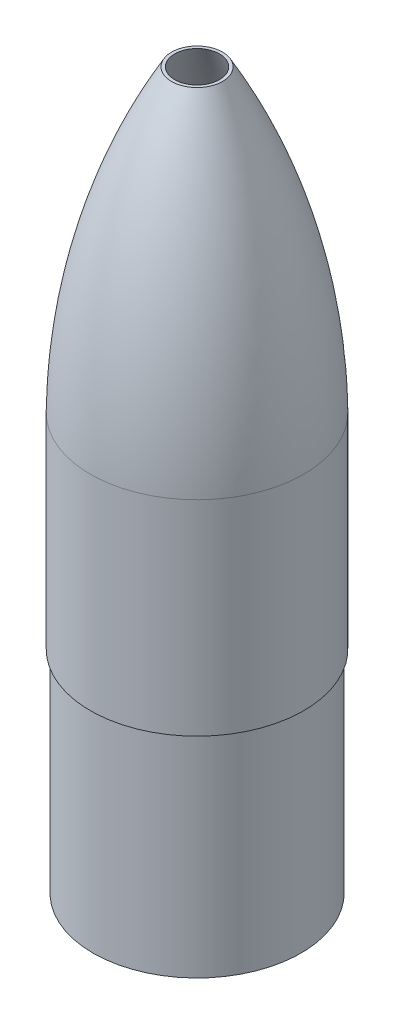
ISO-10303-21;
HEADER;
FILE_DESCRIPTION(('STEP AP214'),'2;1');
FILE_NAME('part.step','',(''),(''),'','','');
FILE_SCHEMA(('AUTOMOTIVE_DESIGN { 1 0 10303 214 1 1 1 1 }'));
ENDSEC;
DATA;
#1=APPLICATION_CONTEXT('core data for automotive mechanical design processes');
#2=APPLICATION_PROTOCOL_DEFINITION('international standard','automotive_design',2000,#1);
#3=PRODUCT_CONTEXT('',#1,'mechanical');
#4=PRODUCT('Part','Part','',(#3));
#5=PRODUCT_RELATED_PRODUCT_CATEGORY('part','',(#4));
#6=PRODUCT_DEFINITION_FORMATION('','',#4);
#7=PRODUCT_DEFINITION_CONTEXT('part definition',#1,'design');
#8=PRODUCT_DEFINITION('design','',#6,#7);
#9=PRODUCT_DEFINITION_SHAPE('','',#8);
#10=(LENGTH_UNIT() NAMED_UNIT(*) SI_UNIT(.MILLI.,.METRE.));
#11=(NAMED_UNIT(*) PLANE_ANGLE_UNIT() SI_UNIT($,.RADIAN.));
#12=(NAMED_UNIT(*) SI_UNIT($,.STERADIAN.) SOLID_ANGLE_UNIT());
#13=UNCERTAINTY_MEASURE_WITH_UNIT(LENGTH_MEASURE(1.E-05),#10,'distance_accuracy_value','');
#14=(GEOMETRIC_REPRESENTATION_CONTEXT(3) GLOBAL_UNCERTAINTY_ASSIGNED_CONTEXT((#13)) GLOBAL_UNIT_ASSIGNED_CONTEXT((#10,
#11,#12)) REPRESENTATION_CONTEXT('',''));
#15=CARTESIAN_POINT('',(0.,0.,0.));
#16=DIRECTION('',(0.,0.,1.));
#17=DIRECTION('',(1.,0.,0.));
#18=AXIS2_PLACEMENT_3D('',#15,#16,#17);
#19=CARTESIAN_POINT('',(78.16,0.555796301470041,0.));
#20=DIRECTION('',(0.,1.,0.));
#21=DIRECTION('',(0.,0.,1.));
#22=AXIS2_PLACEMENT_3D('',#19,#20,#21);
#23=PLANE('',#22);
#24=CARTESIAN_POINT('',(0.,0.555796301470041,0.));
#25=DIRECTION('',(0.,-1.,0.));
#26=DIRECTION('',(0.,0.,-1.));
#27=AXIS2_PLACEMENT_3D('',#24,#25,#26);
#28=CIRCLE('',#27,76.2);
#29=CARTESIAN_POINT('',(0.,0.555796301470041,76.2));
#30=VERTEX_POINT('',#29);
#31=EDGE_CURVE('E41',#30,#30,#28,.T.);
#32=ORIENTED_EDGE('',*,*,#31,.F.);
#33=EDGE_LOOP('',(#32));
#34=FACE_BOUND('',#33,.T.);
#35=CARTESIAN_POINT('',(0.,0.555796301470041,0.));
#36=DIRECTION('',(0.,-1.,0.));
#37=DIRECTION('',(0.,0.,-1.));
#38=AXIS2_PLACEMENT_3D('',#35,#36,#37);
#39=CIRCLE('',#38,78.16);
#40=CARTESIAN_POINT('',(0.,0.555796301470041,-78.16));
#41=VERTEX_POINT('',#40);
#42=EDGE_CURVE('E45',#41,#41,#39,.T.);
#43=ORIENTED_EDGE('',*,*,#42,.T.);
#44=EDGE_LOOP('',(#43));
#45=FACE_BOUND('',#44,.T.);
#46=ADVANCED_FACE('F32',(#34,#45),#23,.F.);
#47=CARTESIAN_POINT('',(0.,-198.817850362013,0.));
#48=DIRECTION('',(0.,-1.,0.));
#49=DIRECTION('',(0.,0.,-1.));
#50=AXIS2_PLACEMENT_3D('',#47,#48,#49);
#51=CYLINDRICAL_SURFACE('',#50,78.1600000000358);
#52=CARTESIAN_POINT('',(0.,150.555796301473,0.));
#53=DIRECTION('',(0.,-1.,0.));
#54=DIRECTION('',(0.,0.,-1.));
#55=AXIS2_PLACEMENT_3D('',#52,#53,#54);
#56=CIRCLE('',#55,78.1600000000715);
#57=CARTESIAN_POINT('',(0.,150.555796301473,-78.1600000000715));
#58=VERTEX_POINT('',#57);
#59=EDGE_CURVE('E50',#58,#58,#56,.T.);
#60=ORIENTED_EDGE('',*,*,#59,.T.);
#61=EDGE_LOOP('',(#60));
#62=FACE_BOUND('',#61,.T.);
#63=ORIENTED_EDGE('',*,*,#42,.F.);
#64=EDGE_LOOP('',(#63));
#65=FACE_BOUND('',#64,.T.);
#66=ADVANCED_FACE('F70',(#62,#65),#51,.T.);
#67=CARTESIAN_POINT('',(-3.54100248339668E-12,400.000000000019,0.));
#68=CARTESIAN_POINT('',(0.211335821958616,399.688125950539,0.));
#69=CARTESIAN_POINT('',(0.635814894562518,399.059576984409,0.));
#70=CARTESIAN_POINT('',(1.53810090052568,397.718447681961,0.));
#71=CARTESIAN_POINT('',(2.52221613507973,396.240558987734,0.));
#72=CARTESIAN_POINT('',(3.50564466868426,394.750882712349,0.));
#73=CARTESIAN_POINT('',(4.50102199868809,393.230772914196,0.));
#74=CARTESIAN_POINT('',(5.4827943041934,391.71794087494,0.));
#75=CARTESIAN_POINT('',(6.46000248743205,390.19904570004,0.));
#76=CARTESIAN_POINT('',(7.43650349854647,388.667903295333,0.));
#77=CARTESIAN_POINT('',(8.4121022457302,387.124567018183,0.));
#78=CARTESIAN_POINT('',(16.4913500878684,374.22880624377,0.));
#79=CARTESIAN_POINT('',(28.3480453483549,353.344444450607,0.));
#80=CARTESIAN_POINT('',(42.541088502936,323.752786495737,0.));
#81=CARTESIAN_POINT('',(57.5292348684686,282.998416237217,0.));
#82=CARTESIAN_POINT('',(68.4497658514673,242.872883660801,0.));
#83=CARTESIAN_POINT('',(74.1096057925069,210.076821303206,0.));
#84=CARTESIAN_POINT('',(76.6558528313221,184.808563000174,0.));
#85=CARTESIAN_POINT('',(77.5184653449877,170.067485067453,0.));
#86=CARTESIAN_POINT('',(77.6804449630636,166.851372886379,0.));
#87=CARTESIAN_POINT('',(77.8001932895896,164.105278721716,0.));
#88=CARTESIAN_POINT('',(77.8720372450868,162.290675769843,0.));
#89=CARTESIAN_POINT('',(77.9363116933117,160.485721022509,0.));
#90=CARTESIAN_POINT('',(77.9933778731587,158.683168323446,0.));
#91=CARTESIAN_POINT('',(78.0434262939293,156.86674010455,0.));
#92=CARTESIAN_POINT('',(78.0859142616916,155.082628956294,0.));
#93=CARTESIAN_POINT('',(78.1211275278516,153.306463123379,0.));
#94=CARTESIAN_POINT('',(78.1454756434559,151.691137071132,0.));
#95=CARTESIAN_POINT('',(78.1555779520431,150.932503957013,0.));
#96=CARTESIAN_POINT('',(78.1600000000715,150.555796301473,0.));
#97=B_SPLINE_CURVE_WITH_KNOTS('',4,(#67,#68,#69,#70,#71,#72,#73,#74,#75,#76,#77,#78,#79,#80,#81,
#82,#83,#84,#85,#86,#87,#88,#89,#90,#91,#92,#93,#94,#95,#96),.UNSPECIFIED.,.F.,.F.,(5,1,1,1,1,1,
1,1,1,1,1,1,1,1,1,1,1,1,1,1,1,1,1,1,1,1,5),(0.0826164282316582,0.088299706346032,
0.0939829844604058,0.0996662625747796,0.105349540689153,0.111032818803527,0.116716096917901,
0.122399375032275,0.128082653146649,0.133891141901002,0.139699630655356,0.313954310904782,
0.430124091568336,0.546293874226719,0.68569761210705,0.836718331478718,0.84833530900807,
0.865760775302099,0.871569264066775,0.877252541384307,0.882935818701838,0.88861909601937,
0.894302373336902,0.899985650654434,0.905668927971966,0.911352205289498,0.91703548260703),.UNSPECIFIED.);
#98=CARTESIAN_POINT('',(0.,-198.817850362013,0.));
#99=DIRECTION('',(0.,-1.,0.));
#100=AXIS1_PLACEMENT('',#98,#99);
#101=SURFACE_OF_REVOLUTION('',#97,#100);
#102=CARTESIAN_POINT('',(0.,370.000000000019,0.));
#103=DIRECTION('',(0.,-1.,0.));
#104=DIRECTION('',(0.,0.,-1.));
#105=AXIS2_PLACEMENT_3D('',#102,#103,#104);
#106=CIRCLE('',#105,18.6686027201573);
#107=CARTESIAN_POINT('',(0.,370.000000000019,-18.6686027201573));
#108=VERTEX_POINT('',#107);
#109=EDGE_CURVE('E105',#108,#108,#106,.T.);
#110=ORIENTED_EDGE('',*,*,#109,.T.);
#111=EDGE_LOOP('',(#110));
#112=FACE_BOUND('',#111,.T.);
#113=ORIENTED_EDGE('',*,*,#59,.F.);
#114=EDGE_LOOP('',(#113));
#115=FACE_BOUND('',#114,.T.);
#116=ADVANCED_FACE('F65',(#112,#115),#101,.T.);
#117=CARTESIAN_POINT('',(0.,150.555796301473,0.));
#118=DIRECTION('',(0.,1.,0.));
#119=DIRECTION('',(0.,0.,1.));
#120=AXIS2_PLACEMENT_3D('',#117,#118,#119);
#121=PLANE('',#120);
#122=CARTESIAN_POINT('',(0.,150.555796301473,0.));
#123=DIRECTION('',(0.,1.,0.));
#124=DIRECTION('',(0.,0.,1.));
#125=AXIS2_PLACEMENT_3D('',#122,#123,#124);
#126=CIRCLE('',#125,73.2);
#127=CARTESIAN_POINT('',(0.,150.555796301473,73.2));
#128=VERTEX_POINT('',#127);
#129=EDGE_CURVE('E101',#128,#128,#126,.T.);
#130=ORIENTED_EDGE('',*,*,#129,.F.);
#131=EDGE_LOOP('',(#130));
#132=FACE_BOUND('',#131,.T.);
#133=CARTESIAN_POINT('',(0.,150.555796301473,0.));
#134=DIRECTION('',(0.,-1.,0.));
#135=DIRECTION('',(0.,0.,-1.));
#136=AXIS2_PLACEMENT_3D('',#133,#134,#135);
#137=CIRCLE('',#136,76.1998641449919);
#138=CARTESIAN_POINT('',(0.,150.555796301473,-76.1998641449919));
#139=VERTEX_POINT('',#138);
#140=EDGE_CURVE('E10',#139,#139,#137,.F.);
#141=ORIENTED_EDGE('',*,*,#140,.T.);
#142=EDGE_LOOP('',(#141));
#143=FACE_BOUND('',#142,.T.);
#144=ADVANCED_FACE('F69',(#132,#143),#121,.T.);
#145=CARTESIAN_POINT('',(0.,-154.244203698527,0.));
#146=DIRECTION('',(0.,1.,0.));
#147=DIRECTION('',(0.,0.,1.));
#148=AXIS2_PLACEMENT_3D('',#145,#146,#147);
#149=CYLINDRICAL_SURFACE('',#148,76.2);
#150=CARTESIAN_POINT('',(0.,-154.244203698527,0.));
#151=DIRECTION('',(0.,1.,0.));
#152=DIRECTION('',(0.,0.,1.));
#153=AXIS2_PLACEMENT_3D('',#150,#151,#152);
#154=CIRCLE('',#153,76.2);
#155=CARTESIAN_POINT('',(0.,-154.244203698527,76.2));
#156=VERTEX_POINT('',#155);
#157=EDGE_CURVE('E53',#156,#156,#154,.T.);
#158=CARTESIAN_POINT('',(0.,-154.244203698527,76.2));
#159=CARTESIAN_POINT('',(0.,-152.631703698527,76.2));
#160=CARTESIAN_POINT('',(0.,-151.019203698527,76.2));
#161=CARTESIAN_POINT('',(0.,-147.794203698527,76.2));
#162=CARTESIAN_POINT('',(0.,-146.181703698527,76.2));
#163=CARTESIAN_POINT('',(0.,-142.956703698527,76.2));
#164=CARTESIAN_POINT('',(0.,-141.344203698527,76.2));
#165=CARTESIAN_POINT('',(0.,-138.119203698527,76.2));
#166=CARTESIAN_POINT('',(0.,-136.506703698527,76.2));
#167=CARTESIAN_POINT('',(0.,-133.281703698528,76.2));
#168=CARTESIAN_POINT('',(0.,-131.669203698528,76.2));
#169=CARTESIAN_POINT('',(0.,-128.444203698528,76.2));
#170=CARTESIAN_POINT('',(0.,-126.831703698528,76.2));
#171=CARTESIAN_POINT('',(0.,-123.606703698528,76.2));
#172=CARTESIAN_POINT('',(0.,-121.994203698528,76.2));
#173=CARTESIAN_POINT('',(0.,-118.769203698528,76.2));
#174=CARTESIAN_POINT('',(0.,-117.156703698528,76.2));
#175=CARTESIAN_POINT('',(0.,-113.931703698528,76.2));
#176=CARTESIAN_POINT('',(0.,-112.319203698528,76.2));
#177=CARTESIAN_POINT('',(0.,-109.094203698528,76.2));
#178=CARTESIAN_POINT('',(0.,-107.481703698528,76.2));
#179=CARTESIAN_POINT('',(0.,-104.256703698528,76.2));
#180=CARTESIAN_POINT('',(0.,-102.644203698528,76.2));
#181=CARTESIAN_POINT('',(0.,-99.4192036985282,76.2));
#182=CARTESIAN_POINT('',(0.,-97.8067036985282,76.2));
#183=CARTESIAN_POINT('',(0.,-94.5817036985282,76.2));
#184=CARTESIAN_POINT('',(0.,-92.9692036985283,76.2));
#185=CARTESIAN_POINT('',(0.,-89.7442036985283,76.2));
#186=CARTESIAN_POINT('',(0.,-88.1317036985284,76.2));
#187=CARTESIAN_POINT('',(0.,-84.9067036985284,76.2));
#188=CARTESIAN_POINT('',(0.,-83.2942036985284,76.2));
#189=CARTESIAN_POINT('',(0.,-80.0692036985285,76.2));
#190=CARTESIAN_POINT('',(0.,-78.4567036985285,76.2));
#191=CARTESIAN_POINT('',(0.,-75.2317036985286,76.2));
#192=CARTESIAN_POINT('',(0.,-73.6192036985286,76.2));
#193=CARTESIAN_POINT('',(0.,-70.3942036985287,76.2));
#194=CARTESIAN_POINT('',(0.,-68.7817036985287,76.2));
#195=CARTESIAN_POINT('',(0.,-65.5567036985288,76.2));
#196=CARTESIAN_POINT('',(0.,-63.9442036985288,76.2));
#197=CARTESIAN_POINT('',(0.,-60.7192036985288,76.2));
#198=CARTESIAN_POINT('',(0.,-59.1067036985289,76.2));
#199=CARTESIAN_POINT('',(0.,-55.8817036985289,76.2));
#200=CARTESIAN_POINT('',(0.,-54.269203698529,76.2));
#201=CARTESIAN_POINT('',(0.,-51.044203698529,76.2));
#202=CARTESIAN_POINT('',(0.,-49.431703698529,76.2));
#203=CARTESIAN_POINT('',(0.,-46.2067036985291,76.2));
#204=CARTESIAN_POINT('',(0.,-44.5942036985291,76.2));
#205=CARTESIAN_POINT('',(0.,-41.3692036985292,76.2));
#206=CARTESIAN_POINT('',(0.,-39.7567036985292,76.2));
#207=CARTESIAN_POINT('',(0.,-36.5317036985293,76.2));
#208=CARTESIAN_POINT('',(0.,-34.9192036985293,76.2));
#209=CARTESIAN_POINT('',(0.,-31.6942036985294,76.2));
#210=CARTESIAN_POINT('',(0.,-30.0817036985294,76.2));
#211=CARTESIAN_POINT('',(0.,-26.8567036985295,76.2));
#212=CARTESIAN_POINT('',(0.,-25.2442036985295,76.2));
#213=CARTESIAN_POINT('',(0.,-22.0192036985295,76.2));
#214=CARTESIAN_POINT('',(0.,-20.4067036985296,76.2));
#215=CARTESIAN_POINT('',(0.,-17.1817036985296,76.2));
#216=CARTESIAN_POINT('',(0.,-15.5692036985297,76.2));
#217=CARTESIAN_POINT('',(0.,-12.3442036985297,76.2));
#218=CARTESIAN_POINT('',(0.,-10.7317036985298,76.2));
#219=CARTESIAN_POINT('',(0.,-7.50670369852981,76.2));
#220=CARTESIAN_POINT('',(0.,-5.89420369852984,76.2));
#221=CARTESIAN_POINT('',(0.,-2.6692036985299,76.2));
#222=CARTESIAN_POINT('',(0.,-1.05670369852993,76.2));
#223=CARTESIAN_POINT('',(0.,0.555796301470041,76.2));
#224=B_SPLINE_CURVE_WITH_KNOTS('',3,(#158,#159,#160,#161,#162,#163,#164,#165,#166,#167,#168,
#169,#170,#171,#172,#173,#174,#175,#176,#177,#178,#179,#180,#181,#182,#183,#184,#185,#186,#187,
#188,#189,#190,#191,#192,#193,#194,#195,#196,#197,#198,#199,#200,#201,#202,#203,#204,#205,#206,
#207,#208,#209,#210,#211,#212,#213,#214,#215,#216,#217,#218,#219,#220,#221,#222,#223),
.UNSPECIFIED.,.F.,.F.,(4,2,2,2,2,2,2,2,2,2,2,2,2,2,2,2,2,2,2,2,2,2,2,2,2,2,2,2,2,2,2,2,4),(0.,
4.83749999999994,9.67499999999985,14.5124999999998,19.3499999999997,24.1874999999996,
29.0249999999995,33.8624999999994,38.6999999999993,43.5374999999992,48.3749999999991,
53.2124999999991,58.049999999999,62.8874999999989,67.7249999999988,72.5624999999987,
77.3999999999986,82.2374999999985,87.0749999999984,91.9124999999984,96.7499999999983,
101.587499999998,106.424999999998,111.262499999998,116.099999999998,120.937499999998,
125.774999999998,130.612499999998,135.449999999998,140.287499999997,145.124999999997,
149.962499999997,154.799999999997),.UNSPECIFIED.);
#225=EDGE_CURVE('BSEAM72',#156,#30,#224,.T.);
#226=ORIENTED_EDGE('',*,*,#157,.T.);
#227=ORIENTED_EDGE('',*,*,#31,.T.);
#228=ORIENTED_EDGE('',*,*,#225,.T.);
#229=ORIENTED_EDGE('',*,*,#225,.F.);
#230=EDGE_LOOP('',(#226,#228,#227,#229));
#231=FACE_BOUND('',#230,.T.);
#232=ADVANCED_FACE('F72',(#231),#149,.T.);
#233=CARTESIAN_POINT('',(0.,-154.244203698527,0.));
#234=DIRECTION('',(0.,1.,0.));
#235=DIRECTION('',(0.,0.,1.));
#236=AXIS2_PLACEMENT_3D('',#233,#234,#235);
#237=PLANE('',#236);
#238=CARTESIAN_POINT('',(0.,-154.244203698527,0.));
#239=DIRECTION('',(0.,1.,0.));
#240=DIRECTION('',(0.,0.,1.));
#241=AXIS2_PLACEMENT_3D('',#238,#239,#240);
#242=CIRCLE('',#241,73.2);
#243=CARTESIAN_POINT('',(0.,-154.244203698527,73.2));
#244=VERTEX_POINT('',#243);
#245=EDGE_CURVE('E99',#244,#244,#242,.T.);
#246=ORIENTED_EDGE('',*,*,#245,.T.);
#247=EDGE_LOOP('',(#246));
#248=FACE_BOUND('',#247,.T.);
#249=ORIENTED_EDGE('',*,*,#157,.F.);
#250=EDGE_LOOP('',(#249));
#251=FACE_BOUND('',#250,.T.);
#252=ADVANCED_FACE('F86',(#248,#251),#237,.F.);
#253=CARTESIAN_POINT('',(0.,-154.244203698527,0.));
#254=DIRECTION('',(0.,1.,0.));
#255=DIRECTION('',(0.,0.,1.));
#256=AXIS2_PLACEMENT_3D('',#253,#254,#255);
#257=CYLINDRICAL_SURFACE('',#256,73.2);
#258=CARTESIAN_POINT('',(0.,-154.244203698527,73.2));
#259=CARTESIAN_POINT('',(0.,-151.069203698527,73.2));
#260=CARTESIAN_POINT('',(0.,-147.894203698527,73.2));
#261=CARTESIAN_POINT('',(0.,-141.544203698527,73.2));
#262=CARTESIAN_POINT('',(0.,-138.369203698527,73.2));
#263=CARTESIAN_POINT('',(0.,-132.019203698527,73.2));
#264=CARTESIAN_POINT('',(0.,-128.844203698527,73.2));
#265=CARTESIAN_POINT('',(0.,-122.494203698527,73.2));
#266=CARTESIAN_POINT('',(0.,-119.319203698527,73.2));
#267=CARTESIAN_POINT('',(0.,-112.969203698527,73.2));
#268=CARTESIAN_POINT('',(0.,-109.794203698527,73.2));
#269=CARTESIAN_POINT('',(0.,-103.444203698527,73.2));
#270=CARTESIAN_POINT('',(0.,-100.269203698527,73.2));
#271=CARTESIAN_POINT('',(0.,-93.9192036985272,73.2));
#272=CARTESIAN_POINT('',(0.,-90.7442036985272,73.2));
#273=CARTESIAN_POINT('',(0.,-84.3942036985272,73.2));
#274=CARTESIAN_POINT('',(0.,-81.2192036985272,73.2));
#275=CARTESIAN_POINT('',(0.,-74.8692036985272,73.2));
#276=CARTESIAN_POINT('',(0.,-71.6942036985271,73.2));
#277=CARTESIAN_POINT('',(0.,-65.3442036985272,73.2));
#278=CARTESIAN_POINT('',(0.,-62.1692036985271,73.2));
#279=CARTESIAN_POINT('',(0.,-55.8192036985271,73.2));
#280=CARTESIAN_POINT('',(0.,-52.6442036985271,73.2));
#281=CARTESIAN_POINT('',(0.,-46.2942036985271,73.2));
#282=CARTESIAN_POINT('',(0.,-43.1192036985272,73.2));
#283=CARTESIAN_POINT('',(0.,-36.7692036985271,73.2));
#284=CARTESIAN_POINT('',(0.,-33.5942036985271,73.2));
#285=CARTESIAN_POINT('',(0.,-27.2442036985271,73.2));
#286=CARTESIAN_POINT('',(0.,-24.0692036985272,73.2));
#287=CARTESIAN_POINT('',(0.,-17.7192036985272,73.2));
#288=CARTESIAN_POINT('',(0.,-14.5442036985272,73.2));
#289=CARTESIAN_POINT('',(0.,-8.19420369852715,73.2));
#290=CARTESIAN_POINT('',(0.,-5.01920369852714,73.2));
#291=CARTESIAN_POINT('',(0.,1.33079630147286,73.2));
#292=CARTESIAN_POINT('',(0.,4.50579630147286,73.2));
#293=CARTESIAN_POINT('',(0.,10.8557963014729,73.2));
#294=CARTESIAN_POINT('',(0.,14.0307963014729,73.2));
#295=CARTESIAN_POINT('',(0.,20.3807963014729,73.2));
#296=CARTESIAN_POINT('',(0.,23.5557963014729,73.2));
#297=CARTESIAN_POINT('',(0.,29.9057963014729,73.2));
#298=CARTESIAN_POINT('',(0.,33.0807963014729,73.2));
#299=CARTESIAN_POINT('',(0.,39.4307963014729,73.2));
#300=CARTESIAN_POINT('',(0.,42.6057963014729,73.2));
#301=CARTESIAN_POINT('',(0.,48.9557963014729,73.2));
#302=CARTESIAN_POINT('',(0.,52.1307963014729,73.2));
#303=CARTESIAN_POINT('',(0.,58.4807963014729,73.2));
#304=CARTESIAN_POINT('',(0.,61.6557963014729,73.2));
#305=CARTESIAN_POINT('',(0.,68.0057963014729,73.2));
#306=CARTESIAN_POINT('',(0.,71.1807963014729,73.2));
#307=CARTESIAN_POINT('',(0.,77.5307963014729,73.2));
#308=CARTESIAN_POINT('',(0.,80.7057963014729,73.2));
#309=CARTESIAN_POINT('',(0.,87.0557963014729,73.2));
#310=CARTESIAN_POINT('',(0.,90.2307963014729,73.2));
#311=CARTESIAN_POINT('',(0.,96.5807963014729,73.2));
#312=CARTESIAN_POINT('',(0.,99.7557963014729,73.2));
#313=CARTESIAN_POINT('',(0.,106.105796301473,73.2));
#314=CARTESIAN_POINT('',(0.,109.280796301473,73.2));
#315=CARTESIAN_POINT('',(0.,115.630796301473,73.2));
#316=CARTESIAN_POINT('',(0.,118.805796301473,73.2));
#317=CARTESIAN_POINT('',(0.,125.155796301473,73.2));
#318=CARTESIAN_POINT('',(0.,128.330796301473,73.2));
#319=CARTESIAN_POINT('',(0.,134.680796301473,73.2));
#320=CARTESIAN_POINT('',(0.,137.855796301473,73.2));
#321=CARTESIAN_POINT('',(0.,144.205796301473,73.2));
#322=CARTESIAN_POINT('',(0.,147.380796301473,73.2));
#323=CARTESIAN_POINT('',(0.,150.555796301473,73.2));
#324=B_SPLINE_CURVE_WITH_KNOTS('',3,(#258,#259,#260,#261,#262,#263,#264,#265,#266,#267,#268,
#269,#270,#271,#272,#273,#274,#275,#276,#277,#278,#279,#280,#281,#282,#283,#284,#285,#286,#287,
#288,#289,#290,#291,#292,#293,#294,#295,#296,#297,#298,#299,#300,#301,#302,#303,#304,#305,#306,
#307,#308,#309,#310,#311,#312,#313,#314,#315,#316,#317,#318,#319,#320,#321,#322,#323),
.UNSPECIFIED.,.F.,.F.,(4,2,2,2,2,2,2,2,2,2,2,2,2,2,2,2,2,2,2,2,2,2,2,2,2,2,2,2,2,2,2,2,4),(0.,
9.52499999999998,19.05,28.575,38.1,47.625,57.15,66.675,76.2,85.725,95.25,104.775,114.3,123.825,
133.35,142.875,152.4,161.925,171.45,180.975,190.5,200.025,209.55,219.075,228.6,238.125,247.65,
257.175,266.7,276.225,285.75,295.275,304.8),.UNSPECIFIED.);
#325=EDGE_CURVE('BSEAM92',#244,#128,#324,.T.);
#326=ORIENTED_EDGE('',*,*,#245,.F.);
#327=ORIENTED_EDGE('',*,*,#129,.T.);
#328=ORIENTED_EDGE('',*,*,#325,.T.);
#329=ORIENTED_EDGE('',*,*,#325,.F.);
#330=EDGE_LOOP('',(#326,#328,#327,#329));
#331=FACE_BOUND('',#330,.T.);
#332=ADVANCED_FACE('F92',(#331),#257,.F.);
#333=CARTESIAN_POINT('',(-1.62256043989055,398.900501196498,0.));
#334=CARTESIAN_POINT('',(-1.4527020894745,398.649836585593,0.));
#335=CARTESIAN_POINT('',(-1.13860808070098,398.184925348062,0.));
#336=CARTESIAN_POINT('',(-0.519571460509534,397.265098357085,0.));
#337=CARTESIAN_POINT('',(0.109915813093936,396.325662034573,0.));
#338=CARTESIAN_POINT('',(0.68726923948598,395.458986867615,0.));
#339=CARTESIAN_POINT('',(1.24825679470018,394.612262216911,0.));
#340=CARTESIAN_POINT('',(1.99947891626582,393.472916561613,0.));
#341=CARTESIAN_POINT('',(3.3229903667817,391.451301251463,0.));
#342=CARTESIAN_POINT('',(5.18273421888216,388.56710601319,0.));
#343=CARTESIAN_POINT('',(9.59209674620897,381.590651126644,0.));
#344=CARTESIAN_POINT('',(18.7944887803775,366.267083025943,0.));
#345=CARTESIAN_POINT('',(36.7943052947311,332.203153979153,0.));
#346=CARTESIAN_POINT('',(57.076508975067,280.924103704226,0.));
#347=CARTESIAN_POINT('',(69.6847325969288,227.24042529235,0.));
#348=CARTESIAN_POINT('',(74.343019544348,188.9958444344,0.));
#349=CARTESIAN_POINT('',(75.5309515534069,171.160960640689,0.));
#350=CARTESIAN_POINT('',(75.8913495939715,162.915707976901,0.));
#351=CARTESIAN_POINT('',(76.0100982186272,159.486050775157,0.));
#352=CARTESIAN_POINT('',(76.0769403496039,157.070550777706,0.));
#353=CARTESIAN_POINT('',(76.1102467073511,155.706228582079,0.));
#354=CARTESIAN_POINT('',(76.1327803120506,154.690650433653,0.));
#355=CARTESIAN_POINT('',(76.1532510311831,153.650034533213,0.));
#356=CARTESIAN_POINT('',(76.1724217564322,152.520648043593,0.));
#357=CARTESIAN_POINT('',(76.1890273263125,151.409738143698,0.));
#358=CARTESIAN_POINT('',(76.1964277692495,150.847643517066,0.));
#359=CARTESIAN_POINT('',(76.2,150.544274919865,0.));
#360=B_SPLINE_CURVE_WITH_KNOTS('',3,(#333,#334,#335,#336,#337,#338,#339,#340,#341,#342,#343,
#344,#345,#346,#347,#348,#349,#350,#351,#352,#353,#354,#355,#356,#357,#358,#359),.UNSPECIFIED.,
.F.,.F.,(4,1,1,1,1,1,1,1,1,1,1,1,1,1,1,1,1,1,1,1,1,1,1,1,4),(0.0826164282316582,
0.0858757074160786,0.0891349866004989,0.0923942657849193,0.0956535449693396,0.09891282415376,
0.10217210333818,0.108690661707021,0.121727778444703,0.134764895182384,0.18691336213311,
0.291210296034561,0.499804163837465,0.708398031640368,0.81269496554182,0.864843432492545,
0.877880549230227,0.890917665967908,0.897436224336749,0.900695503521169,0.90395478270559,
0.90721406189001,0.910473341074431,0.913732620258851,0.916991899443271),.UNSPECIFIED.);
#361=CARTESIAN_POINT('',(0.,-198.817850362013,0.));
#362=DIRECTION('',(0.,-1.,0.));
#363=AXIS1_PLACEMENT('',#361,#362);
#364=SURFACE_OF_REVOLUTION('',#360,#363);
#365=CARTESIAN_POINT('',(0.,370.000000000019,0.));
#366=DIRECTION('',(0.,-1.,0.));
#367=DIRECTION('',(0.,0.,-1.));
#368=AXIS2_PLACEMENT_3D('',#365,#366,#367);
#369=CIRCLE('',#368,16.4113904058644);
#370=CARTESIAN_POINT('',(0.,370.000000000019,-16.4113904058644));
#371=VERTEX_POINT('',#370);
#372=EDGE_CURVE('E37',#371,#371,#369,.T.);
#373=ORIENTED_EDGE('',*,*,#372,.F.);
#374=EDGE_LOOP('',(#373));
#375=FACE_BOUND('',#374,.T.);
#376=ORIENTED_EDGE('',*,*,#140,.F.);
#377=EDGE_LOOP('',(#376));
#378=FACE_BOUND('',#377,.T.);
#379=ADVANCED_FACE('F34',(#375,#378),#364,.F.);
#380=CARTESIAN_POINT('',(-3.54100248339668E-12,370.000000000019,0.));
#381=DIRECTION('',(0.,-1.,0.));
#382=DIRECTION('',(0.,0.,-1.));
#383=AXIS2_PLACEMENT_3D('',#380,#381,#382);
#384=PLANE('',#383);
#385=ORIENTED_EDGE('',*,*,#372,.T.);
#386=EDGE_LOOP('',(#385));
#387=FACE_BOUND('',#386,.T.);
#388=ORIENTED_EDGE('',*,*,#109,.F.);
#389=EDGE_LOOP('',(#388));
#390=FACE_BOUND('',#389,.T.);
#391=ADVANCED_FACE('F112',(#387,#390),#384,.F.);
#392=CLOSED_SHELL('',(#46,#66,#116,#144,#232,#252,#332,#379,#391));
#393=MANIFOLD_SOLID_BREP('B2',#392);
#394=ADVANCED_BREP_SHAPE_REPRESENTATION('',(#18,#393),#14);
#395=SHAPE_DEFINITION_REPRESENTATION(#9,#394);
ENDSEC;
END-ISO-10303-21;
